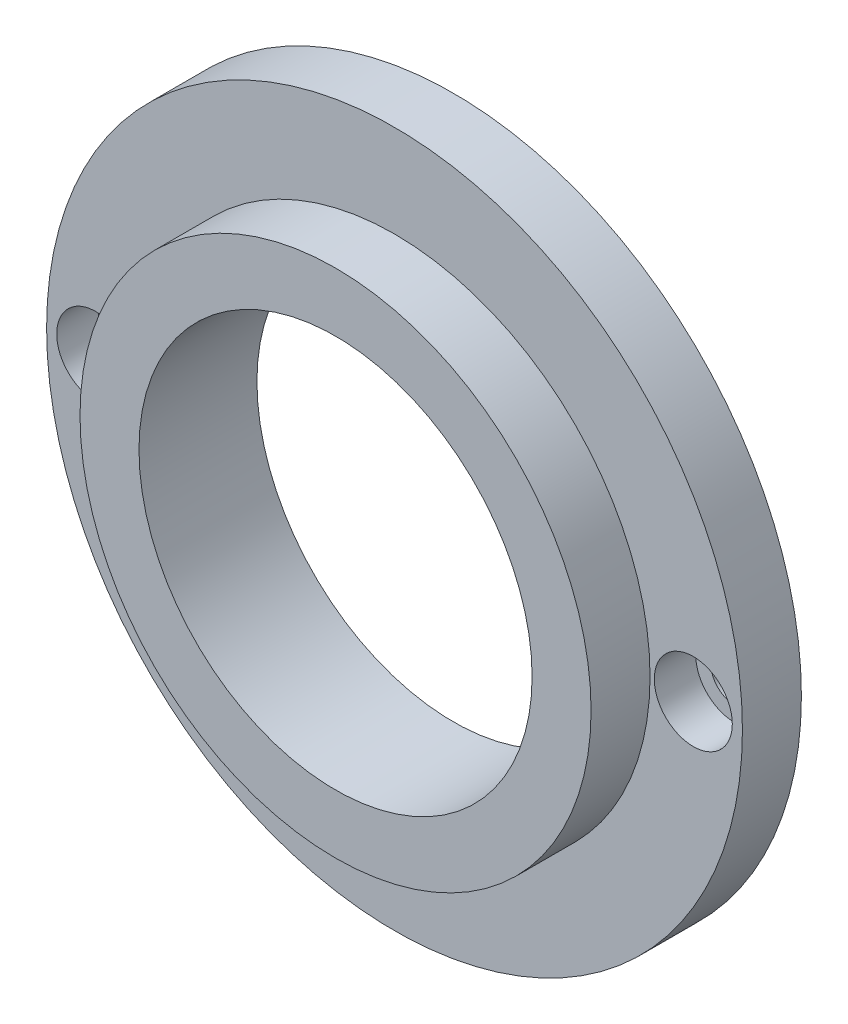
ISO-10303-21;
HEADER;
FILE_DESCRIPTION(('STEP AP214'),'2;1');
FILE_NAME('part.step','',(''),(''),'','','');
FILE_SCHEMA(('AUTOMOTIVE_DESIGN { 1 0 10303 214 1 1 1 1 }'));
ENDSEC;
DATA;
#1=APPLICATION_CONTEXT('core data for automotive mechanical design processes');
#2=APPLICATION_PROTOCOL_DEFINITION('international standard','automotive_design',2000,#1);
#3=PRODUCT_CONTEXT('',#1,'mechanical');
#4=PRODUCT('Part','Part','',(#3));
#5=PRODUCT_RELATED_PRODUCT_CATEGORY('part','',(#4));
#6=PRODUCT_DEFINITION_FORMATION('','',#4);
#7=PRODUCT_DEFINITION_CONTEXT('part definition',#1,'design');
#8=PRODUCT_DEFINITION('design','',#6,#7);
#9=PRODUCT_DEFINITION_SHAPE('','',#8);
#10=(LENGTH_UNIT() NAMED_UNIT(*) SI_UNIT(.MILLI.,.METRE.));
#11=(NAMED_UNIT(*) PLANE_ANGLE_UNIT() SI_UNIT($,.RADIAN.));
#12=(NAMED_UNIT(*) SI_UNIT($,.STERADIAN.) SOLID_ANGLE_UNIT());
#13=UNCERTAINTY_MEASURE_WITH_UNIT(LENGTH_MEASURE(1.E-05),#10,'distance_accuracy_value','');
#14=(GEOMETRIC_REPRESENTATION_CONTEXT(3) GLOBAL_UNCERTAINTY_ASSIGNED_CONTEXT((#13)) GLOBAL_UNIT_ASSIGNED_CONTEXT((#10,
#11,#12)) REPRESENTATION_CONTEXT('',''));
#15=CARTESIAN_POINT('',(0.,0.,0.));
#16=DIRECTION('',(0.,0.,1.));
#17=DIRECTION('',(1.,0.,0.));
#18=AXIS2_PLACEMENT_3D('',#15,#16,#17);
#19=CARTESIAN_POINT('',(0.,0.,3.));
#20=DIRECTION('',(0.,0.,1.));
#21=DIRECTION('',(1.,0.,0.));
#22=AXIS2_PLACEMENT_3D('',#19,#20,#21);
#23=PLANE('',#22);
#24=CARTESIAN_POINT('',(0.,0.,3.));
#25=DIRECTION('',(0.,0.,1.));
#26=DIRECTION('',(1.,0.,0.));
#27=AXIS2_PLACEMENT_3D('',#24,#25,#26);
#28=CIRCLE('',#27,13.);
#29=CARTESIAN_POINT('',(13.,0.,3.));
#30=VERTEX_POINT('',#29);
#31=EDGE_CURVE('E10',#30,#30,#28,.T.);
#32=ORIENTED_EDGE('',*,*,#31,.T.);
#33=EDGE_LOOP('',(#32));
#34=FACE_BOUND('',#33,.T.);
#35=CARTESIAN_POINT('',(0.,0.,3.));
#36=DIRECTION('',(0.,0.,1.));
#37=DIRECTION('',(1.,0.,0.));
#38=AXIS2_PLACEMENT_3D('',#35,#36,#37);
#39=CIRCLE('',#38,10.);
#40=CARTESIAN_POINT('',(10.,0.,3.));
#41=VERTEX_POINT('',#40);
#42=EDGE_CURVE('E48',#41,#41,#39,.T.);
#43=ORIENTED_EDGE('',*,*,#42,.F.);
#44=EDGE_LOOP('',(#43));
#45=FACE_BOUND('',#44,.T.);
#46=ADVANCED_FACE('F39',(#34,#45),#23,.T.);
#47=CARTESIAN_POINT('',(0.,0.,3.));
#48=DIRECTION('',(0.,0.,-1.));
#49=DIRECTION('',(-1.,0.,0.));
#50=AXIS2_PLACEMENT_3D('',#47,#48,#49);
#51=CYLINDRICAL_SURFACE('',#50,13.);
#52=ORIENTED_EDGE('',*,*,#31,.F.);
#53=EDGE_LOOP('',(#52));
#54=FACE_BOUND('',#53,.T.);
#55=CARTESIAN_POINT('',(0.,0.,0.));
#56=DIRECTION('',(0.,0.,1.));
#57=DIRECTION('',(1.,0.,0.));
#58=AXIS2_PLACEMENT_3D('',#55,#56,#57);
#59=CIRCLE('',#58,13.);
#60=CARTESIAN_POINT('',(13.,0.,0.));
#61=VERTEX_POINT('',#60);
#62=EDGE_CURVE('E43',#61,#61,#59,.T.);
#63=ORIENTED_EDGE('',*,*,#62,.T.);
#64=EDGE_LOOP('',(#63));
#65=FACE_BOUND('',#64,.T.);
#66=ADVANCED_FACE('F41',(#54,#65),#51,.T.);
#67=CARTESIAN_POINT('',(0.,0.,3.));
#68=DIRECTION('',(0.,0.,-1.));
#69=DIRECTION('',(-1.,0.,0.));
#70=AXIS2_PLACEMENT_3D('',#67,#68,#69);
#71=CYLINDRICAL_SURFACE('',#70,10.);
#72=ORIENTED_EDGE('',*,*,#42,.T.);
#73=EDGE_LOOP('',(#72));
#74=FACE_BOUND('',#73,.T.);
#75=CARTESIAN_POINT('',(0.,0.,-3.));
#76=DIRECTION('',(0.,0.,-1.));
#77=DIRECTION('',(-1.,0.,0.));
#78=AXIS2_PLACEMENT_3D('',#75,#76,#77);
#79=CIRCLE('',#78,10.);
#80=CARTESIAN_POINT('',(-10.,0.,-3.));
#81=VERTEX_POINT('',#80);
#82=EDGE_CURVE('E60',#81,#81,#79,.T.);
#83=ORIENTED_EDGE('',*,*,#82,.T.);
#84=EDGE_LOOP('',(#83));
#85=FACE_BOUND('',#84,.T.);
#86=ADVANCED_FACE('F131',(#74,#85),#71,.F.);
#87=CARTESIAN_POINT('',(0.,0.,-3.));
#88=DIRECTION('',(0.,0.,-1.));
#89=DIRECTION('',(-1.,0.,0.));
#90=AXIS2_PLACEMENT_3D('',#87,#88,#89);
#91=PLANE('',#90);
#92=CARTESIAN_POINT('',(-15.2,0.,-3.));
#93=DIRECTION('',(0.,0.,1.));
#94=DIRECTION('',(1.,0.,0.));
#95=AXIS2_PLACEMENT_3D('',#92,#93,#94);
#96=CIRCLE('',#95,1.2192);
#97=CARTESIAN_POINT('',(-13.9808,0.,-3.));
#98=VERTEX_POINT('',#97);
#99=EDGE_CURVE('E83',#98,#98,#96,.T.);
#100=ORIENTED_EDGE('',*,*,#99,.T.);
#101=EDGE_LOOP('',(#100));
#102=FACE_BOUND('',#101,.T.);
#103=CARTESIAN_POINT('',(15.2,0.,-3.));
#104=DIRECTION('',(0.,0.,1.));
#105=DIRECTION('',(1.,0.,0.));
#106=AXIS2_PLACEMENT_3D('',#103,#104,#105);
#107=CIRCLE('',#106,1.2192);
#108=CARTESIAN_POINT('',(16.4192,0.,-3.));
#109=VERTEX_POINT('',#108);
#110=EDGE_CURVE('E67',#109,#109,#107,.T.);
#111=ORIENTED_EDGE('',*,*,#110,.T.);
#112=EDGE_LOOP('',(#111));
#113=FACE_BOUND('',#112,.T.);
#114=CARTESIAN_POINT('',(0.,0.,-3.));
#115=DIRECTION('',(0.,0.,-1.));
#116=DIRECTION('',(-1.,0.,0.));
#117=AXIS2_PLACEMENT_3D('',#114,#115,#116);
#118=CIRCLE('',#117,17.7);
#119=CARTESIAN_POINT('',(-17.7,0.,-3.));
#120=VERTEX_POINT('',#119);
#121=EDGE_CURVE('E59',#120,#120,#118,.T.);
#122=ORIENTED_EDGE('',*,*,#121,.T.);
#123=EDGE_LOOP('',(#122));
#124=FACE_BOUND('',#123,.T.);
#125=ORIENTED_EDGE('',*,*,#82,.F.);
#126=EDGE_LOOP('',(#125));
#127=FACE_BOUND('',#126,.T.);
#128=ADVANCED_FACE('F106',(#102,#113,#124,#127),#91,.T.);
#129=CARTESIAN_POINT('',(0.,0.,0.));
#130=DIRECTION('',(0.,0.,-1.));
#131=DIRECTION('',(-1.,0.,0.));
#132=AXIS2_PLACEMENT_3D('',#129,#130,#131);
#133=PLANE('',#132);
#134=CARTESIAN_POINT('',(-15.2,0.,0.));
#135=DIRECTION('',(0.,0.,1.));
#136=DIRECTION('',(1.,0.,0.));
#137=AXIS2_PLACEMENT_3D('',#134,#135,#136);
#138=CIRCLE('',#137,1.98501);
#139=CARTESIAN_POINT('',(-13.21499,0.,0.));
#140=VERTEX_POINT('',#139);
#141=EDGE_CURVE('E95',#140,#140,#138,.T.);
#142=ORIENTED_EDGE('',*,*,#141,.F.);
#143=EDGE_LOOP('',(#142));
#144=FACE_BOUND('',#143,.T.);
#145=CARTESIAN_POINT('',(15.2,0.,0.));
#146=DIRECTION('',(0.,0.,1.));
#147=DIRECTION('',(1.,0.,0.));
#148=AXIS2_PLACEMENT_3D('',#145,#146,#147);
#149=CIRCLE('',#148,1.98501);
#150=CARTESIAN_POINT('',(17.18501,0.,0.));
#151=VERTEX_POINT('',#150);
#152=EDGE_CURVE('E79',#151,#151,#149,.T.);
#153=ORIENTED_EDGE('',*,*,#152,.F.);
#154=EDGE_LOOP('',(#153));
#155=FACE_BOUND('',#154,.T.);
#156=ORIENTED_EDGE('',*,*,#62,.F.);
#157=EDGE_LOOP('',(#156));
#158=FACE_BOUND('',#157,.T.);
#159=CARTESIAN_POINT('',(0.,0.,0.));
#160=DIRECTION('',(0.,0.,-1.));
#161=DIRECTION('',(-1.,0.,0.));
#162=AXIS2_PLACEMENT_3D('',#159,#160,#161);
#163=CIRCLE('',#162,17.7);
#164=CARTESIAN_POINT('',(-17.7,0.,0.));
#165=VERTEX_POINT('',#164);
#166=EDGE_CURVE('E55',#165,#165,#163,.T.);
#167=ORIENTED_EDGE('',*,*,#166,.F.);
#168=EDGE_LOOP('',(#167));
#169=FACE_BOUND('',#168,.T.);
#170=ADVANCED_FACE('F102',(#144,#155,#158,#169),#133,.F.);
#171=CARTESIAN_POINT('',(0.,0.,-3.));
#172=DIRECTION('',(0.,0.,1.));
#173=DIRECTION('',(1.,0.,0.));
#174=AXIS2_PLACEMENT_3D('',#171,#172,#173);
#175=CYLINDRICAL_SURFACE('',#174,17.7);
#176=ORIENTED_EDGE('',*,*,#121,.F.);
#177=EDGE_LOOP('',(#176));
#178=FACE_BOUND('',#177,.T.);
#179=ORIENTED_EDGE('',*,*,#166,.T.);
#180=EDGE_LOOP('',(#179));
#181=FACE_BOUND('',#180,.T.);
#182=ADVANCED_FACE('F105',(#178,#181),#175,.T.);
#183=CARTESIAN_POINT('',(15.2,0.,0.));
#184=DIRECTION('',(0.,0.,1.));
#185=DIRECTION('',(1.,0.,0.));
#186=AXIS2_PLACEMENT_3D('',#183,#184,#185);
#187=CYLINDRICAL_SURFACE('',#186,1.2192);
#188=ORIENTED_EDGE('',*,*,#110,.F.);
#189=EDGE_LOOP('',(#188));
#190=FACE_BOUND('',#189,.T.);
#191=CARTESIAN_POINT('',(15.2,0.,-2.1082));
#192=DIRECTION('',(0.,0.,1.));
#193=DIRECTION('',(1.,0.,0.));
#194=AXIS2_PLACEMENT_3D('',#191,#192,#193);
#195=CIRCLE('',#194,1.2192);
#196=CARTESIAN_POINT('',(16.4192,0.,-2.1082));
#197=VERTEX_POINT('',#196);
#198=EDGE_CURVE('E71',#197,#197,#195,.T.);
#199=ORIENTED_EDGE('',*,*,#198,.T.);
#200=EDGE_LOOP('',(#199));
#201=FACE_BOUND('',#200,.T.);
#202=ADVANCED_FACE('F116',(#190,#201),#187,.F.);
#203=CARTESIAN_POINT('',(16.4192,0.,-2.1082));
#204=DIRECTION('',(0.,0.,-1.));
#205=DIRECTION('',(-1.,0.,0.));
#206=AXIS2_PLACEMENT_3D('',#203,#204,#205);
#207=PLANE('',#206);
#208=ORIENTED_EDGE('',*,*,#198,.F.);
#209=EDGE_LOOP('',(#208));
#210=FACE_BOUND('',#209,.T.);
#211=CARTESIAN_POINT('',(15.2,0.,-2.1082));
#212=DIRECTION('',(0.,0.,1.));
#213=DIRECTION('',(1.,0.,0.));
#214=AXIS2_PLACEMENT_3D('',#211,#212,#213);
#215=CIRCLE('',#214,1.98501);
#216=CARTESIAN_POINT('',(17.18501,0.,-2.1082));
#217=VERTEX_POINT('',#216);
#218=EDGE_CURVE('E75',#217,#217,#215,.T.);
#219=ORIENTED_EDGE('',*,*,#218,.T.);
#220=EDGE_LOOP('',(#219));
#221=FACE_BOUND('',#220,.T.);
#222=ADVANCED_FACE('F122',(#210,#221),#207,.F.);
#223=CARTESIAN_POINT('',(15.2,0.,0.));
#224=DIRECTION('',(0.,0.,1.));
#225=DIRECTION('',(1.,0.,0.));
#226=AXIS2_PLACEMENT_3D('',#223,#224,#225);
#227=CYLINDRICAL_SURFACE('',#226,1.98501);
#228=ORIENTED_EDGE('',*,*,#218,.F.);
#229=EDGE_LOOP('',(#228));
#230=FACE_BOUND('',#229,.T.);
#231=ORIENTED_EDGE('',*,*,#152,.T.);
#232=EDGE_LOOP('',(#231));
#233=FACE_BOUND('',#232,.T.);
#234=ADVANCED_FACE('F151',(#230,#233),#227,.F.);
#235=CARTESIAN_POINT('',(-15.2,0.,0.));
#236=DIRECTION('',(0.,0.,1.));
#237=DIRECTION('',(1.,0.,0.));
#238=AXIS2_PLACEMENT_3D('',#235,#236,#237);
#239=CYLINDRICAL_SURFACE('',#238,1.2192);
#240=ORIENTED_EDGE('',*,*,#99,.F.);
#241=EDGE_LOOP('',(#240));
#242=FACE_BOUND('',#241,.T.);
#243=CARTESIAN_POINT('',(-15.2,0.,-2.1082));
#244=DIRECTION('',(0.,0.,1.));
#245=DIRECTION('',(1.,0.,0.));
#246=AXIS2_PLACEMENT_3D('',#243,#244,#245);
#247=CIRCLE('',#246,1.2192);
#248=CARTESIAN_POINT('',(-13.9808,0.,-2.1082));
#249=VERTEX_POINT('',#248);
#250=EDGE_CURVE('E87',#249,#249,#247,.T.);
#251=ORIENTED_EDGE('',*,*,#250,.T.);
#252=EDGE_LOOP('',(#251));
#253=FACE_BOUND('',#252,.T.);
#254=ADVANCED_FACE('F155',(#242,#253),#239,.F.);
#255=CARTESIAN_POINT('',(-13.9808,0.,-2.1082));
#256=DIRECTION('',(0.,0.,-1.));
#257=DIRECTION('',(-1.,0.,0.));
#258=AXIS2_PLACEMENT_3D('',#255,#256,#257);
#259=PLANE('',#258);
#260=ORIENTED_EDGE('',*,*,#250,.F.);
#261=EDGE_LOOP('',(#260));
#262=FACE_BOUND('',#261,.T.);
#263=CARTESIAN_POINT('',(-15.2,0.,-2.1082));
#264=DIRECTION('',(0.,0.,1.));
#265=DIRECTION('',(1.,0.,0.));
#266=AXIS2_PLACEMENT_3D('',#263,#264,#265);
#267=CIRCLE('',#266,1.98501);
#268=CARTESIAN_POINT('',(-13.21499,0.,-2.1082));
#269=VERTEX_POINT('',#268);
#270=EDGE_CURVE('E91',#269,#269,#267,.T.);
#271=ORIENTED_EDGE('',*,*,#270,.T.);
#272=EDGE_LOOP('',(#271));
#273=FACE_BOUND('',#272,.T.);
#274=ADVANCED_FACE('F159',(#262,#273),#259,.F.);
#275=CARTESIAN_POINT('',(-15.2,0.,0.));
#276=DIRECTION('',(0.,0.,1.));
#277=DIRECTION('',(1.,0.,0.));
#278=AXIS2_PLACEMENT_3D('',#275,#276,#277);
#279=CYLINDRICAL_SURFACE('',#278,1.98501);
#280=ORIENTED_EDGE('',*,*,#270,.F.);
#281=EDGE_LOOP('',(#280));
#282=FACE_BOUND('',#281,.T.);
#283=ORIENTED_EDGE('',*,*,#141,.T.);
#284=EDGE_LOOP('',(#283));
#285=FACE_BOUND('',#284,.T.);
#286=ADVANCED_FACE('F100',(#282,#285),#279,.F.);
#287=CLOSED_SHELL('',(#46,#66,#86,#128,#170,#182,#202,#222,#234,#254,#274,#286));
#288=MANIFOLD_SOLID_BREP('B2',#287);
#289=ADVANCED_BREP_SHAPE_REPRESENTATION('',(#18,#288),#14);
#290=SHAPE_DEFINITION_REPRESENTATION(#9,#289);
ENDSEC;
END-ISO-10303-21;
